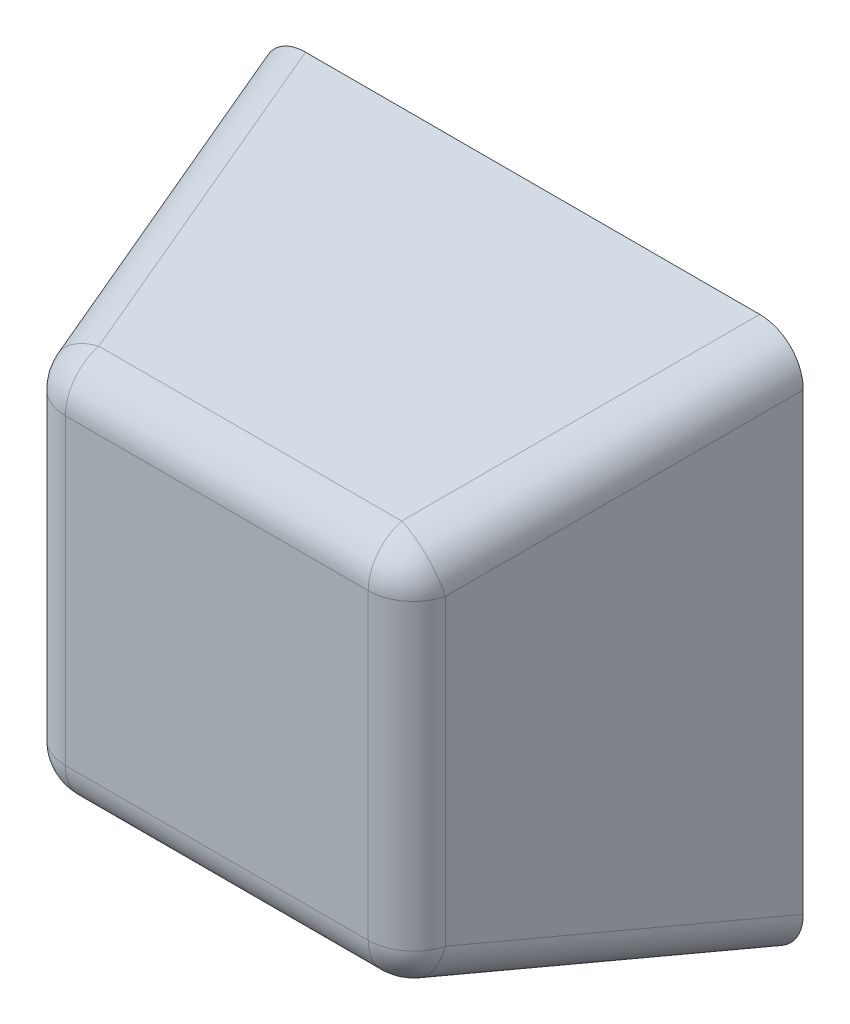
ISO-10303-21;
HEADER;
FILE_DESCRIPTION(('STEP AP214'),'2;1');
FILE_NAME('part.step','',(''),(''),'','','');
FILE_SCHEMA(('AUTOMOTIVE_DESIGN { 1 0 10303 214 1 1 1 1 }'));
ENDSEC;
DATA;
#1=APPLICATION_CONTEXT('core data for automotive mechanical design processes');
#2=APPLICATION_PROTOCOL_DEFINITION('international standard','automotive_design',2000,#1);
#3=PRODUCT_CONTEXT('',#1,'mechanical');
#4=PRODUCT('Part','Part','',(#3));
#5=PRODUCT_RELATED_PRODUCT_CATEGORY('part','',(#4));
#6=PRODUCT_DEFINITION_FORMATION('','',#4);
#7=PRODUCT_DEFINITION_CONTEXT('part definition',#1,'design');
#8=PRODUCT_DEFINITION('design','',#6,#7);
#9=PRODUCT_DEFINITION_SHAPE('','',#8);
#10=(LENGTH_UNIT() NAMED_UNIT(*) SI_UNIT(.MILLI.,.METRE.));
#11=(NAMED_UNIT(*) PLANE_ANGLE_UNIT() SI_UNIT($,.RADIAN.));
#12=(NAMED_UNIT(*) SI_UNIT($,.STERADIAN.) SOLID_ANGLE_UNIT());
#13=UNCERTAINTY_MEASURE_WITH_UNIT(LENGTH_MEASURE(1.E-05),#10,'distance_accuracy_value','');
#14=(GEOMETRIC_REPRESENTATION_CONTEXT(3) GLOBAL_UNCERTAINTY_ASSIGNED_CONTEXT((#13)) GLOBAL_UNIT_ASSIGNED_CONTEXT((#10,
#11,#12)) REPRESENTATION_CONTEXT('',''));
#15=CARTESIAN_POINT('',(0.,0.,0.));
#16=DIRECTION('',(0.,0.,1.));
#17=DIRECTION('',(1.,0.,0.));
#18=AXIS2_PLACEMENT_3D('',#15,#16,#17);
#19=CARTESIAN_POINT('',(0.,0.,0.));
#20=DIRECTION('',(-0.965925826289068,0.,0.258819045102521));
#21=DIRECTION('',(0.258819045102521,0.,0.965925826289068));
#22=AXIS2_PLACEMENT_3D('',#19,#20,#21);
#23=PLANE('',#22);
#24=DIRECTION('',(0.,-1.,0.));
#25=VECTOR('',#24,1.);
#26=CARTESIAN_POINT('',(0.,0.,0.));
#27=LINE('',#26,#25);
#28=CARTESIAN_POINT('',(0.,11.0340741737109,0.));
#29=VERTEX_POINT('',#28);
#30=CARTESIAN_POINT('',(0.,0.965925826289068,0.));
#31=VERTEX_POINT('',#30);
#32=EDGE_CURVE('E197',#29,#31,#27,.T.);
#33=ORIENTED_EDGE('',*,*,#32,.T.);
#34=DIRECTION('',(0.250562807085732,0.250562807085732,0.935113126531029));
#35=VECTOR('',#34,1.);
#36=CARTESIAN_POINT('',(-0.0606424850514894,0.905283341237579,-0.226320835309395));
#37=LINE('',#36,#35);
#38=CARTESIAN_POINT('',(1.67704550870775,2.64297133499682,6.25881904510252));
#39=VERTEX_POINT('',#38);
#40=EDGE_CURVE('E49',#31,#39,#37,.T.);
#41=ORIENTED_EDGE('',*,*,#40,.T.);
#42=DIRECTION('',(0.,-1.,0.));
#43=VECTOR('',#42,1.);
#44=CARTESIAN_POINT('',(1.67704550870775,0.,6.25881904510252));
#45=LINE('',#44,#43);
#46=CARTESIAN_POINT('',(1.67704550870775,9.35702866500318,6.25881904510252));
#47=VERTEX_POINT('',#46);
#48=EDGE_CURVE('E54',#39,#47,#45,.F.);
#49=ORIENTED_EDGE('',*,*,#48,.T.);
#50=DIRECTION('',(0.250562807085732,-0.250562807085732,0.935113126531029));
#51=VECTOR('',#50,1.);
#52=CARTESIAN_POINT('',(0.692738158484689,10.3413360152262,2.58533400380656));
#53=LINE('',#52,#51);
#54=EDGE_CURVE('E166',#47,#29,#53,.F.);
#55=ORIENTED_EDGE('',*,*,#54,.T.);
#56=EDGE_LOOP('',(#33,#41,#49,#55));
#57=FACE_BOUND('',#56,.T.);
#58=ADVANCED_FACE('F32',(#57),#23,.T.);
#59=CARTESIAN_POINT('',(0.,0.,0.));
#60=DIRECTION('',(0.,-0.965925826289068,0.258819045102521));
#61=DIRECTION('',(0.,-0.258819045102521,-0.965925826289068));
#62=AXIS2_PLACEMENT_3D('',#59,#60,#61);
#63=PLANE('',#62);
#64=DIRECTION('',(1.,0.,0.));
#65=VECTOR('',#64,1.);
#66=CARTESIAN_POINT('',(0.,1.67704550870775,6.25881904510252));
#67=LINE('',#66,#65);
#68=CARTESIAN_POINT('',(9.35702866500318,1.67704550870775,6.25881904510252));
#69=VERTEX_POINT('',#68);
#70=CARTESIAN_POINT('',(2.64297133499682,1.67704550870775,6.25881904510252));
#71=VERTEX_POINT('',#70);
#72=EDGE_CURVE('E162',#69,#71,#67,.F.);
#73=ORIENTED_EDGE('',*,*,#72,.T.);
#74=DIRECTION('',(0.250562807085732,0.250562807085732,0.935113126531029));
#75=VECTOR('',#74,1.);
#76=CARTESIAN_POINT('',(0.905283341237579,-0.0606424850514895,-0.226320835309395));
#77=LINE('',#76,#75);
#78=CARTESIAN_POINT('',(0.965925826289069,0.,0.));
#79=VERTEX_POINT('',#78);
#80=EDGE_CURVE('E164',#71,#79,#77,.F.);
#81=ORIENTED_EDGE('',*,*,#80,.T.);
#82=DIRECTION('',(1.,0.,0.));
#83=VECTOR('',#82,1.);
#84=CARTESIAN_POINT('',(0.,0.,0.));
#85=LINE('',#84,#83);
#86=CARTESIAN_POINT('',(11.0340741737109,0.,0.));
#87=VERTEX_POINT('',#86);
#88=EDGE_CURVE('E199',#79,#87,#85,.T.);
#89=ORIENTED_EDGE('',*,*,#88,.T.);
#90=DIRECTION('',(-0.250562807085732,0.250562807085732,0.935113126531029));
#91=VECTOR('',#90,1.);
#92=CARTESIAN_POINT('',(10.3413360152262,0.692738158484689,2.58533400380656));
#93=LINE('',#92,#91);
#94=EDGE_CURVE('E160',#87,#69,#93,.T.);
#95=ORIENTED_EDGE('',*,*,#94,.T.);
#96=EDGE_LOOP('',(#73,#81,#89,#95));
#97=FACE_BOUND('',#96,.T.);
#98=ADVANCED_FACE('F251',(#97),#63,.T.);
#99=CARTESIAN_POINT('',(12.,0.,0.));
#100=DIRECTION('',(0.965925826289068,0.,0.258819045102521));
#101=DIRECTION('',(0.258819045102521,0.,-0.965925826289068));
#102=AXIS2_PLACEMENT_3D('',#99,#100,#101);
#103=PLANE('',#102);
#104=DIRECTION('',(0.,1.,0.));
#105=VECTOR('',#104,1.);
#106=CARTESIAN_POINT('',(12.,0.,0.));
#107=LINE('',#106,#105);
#108=CARTESIAN_POINT('',(12.,0.965925826289069,0.));
#109=VERTEX_POINT('',#108);
#110=CARTESIAN_POINT('',(12.,11.0340741737109,0.));
#111=VERTEX_POINT('',#110);
#112=EDGE_CURVE('E203',#109,#111,#107,.T.);
#113=ORIENTED_EDGE('',*,*,#112,.T.);
#114=DIRECTION('',(-0.250562807085732,-0.250562807085732,0.935113126531029));
#115=VECTOR('',#114,1.);
#116=CARTESIAN_POINT('',(11.3072618415153,10.3413360152262,2.58533400380656));
#117=LINE('',#116,#115);
#118=CARTESIAN_POINT('',(10.3229544912922,9.35702866500318,6.25881904510252));
#119=VERTEX_POINT('',#118);
#120=EDGE_CURVE('E158',#111,#119,#117,.T.);
#121=ORIENTED_EDGE('',*,*,#120,.T.);
#122=DIRECTION('',(0.,1.,0.));
#123=VECTOR('',#122,1.);
#124=CARTESIAN_POINT('',(10.3229544912922,0.,6.25881904510252));
#125=LINE('',#124,#123);
#126=CARTESIAN_POINT('',(10.3229544912922,2.64297133499682,6.25881904510252));
#127=VERTEX_POINT('',#126);
#128=EDGE_CURVE('E156',#119,#127,#125,.F.);
#129=ORIENTED_EDGE('',*,*,#128,.T.);
#130=DIRECTION('',(-0.250562807085732,0.250562807085732,0.935113126531029));
#131=VECTOR('',#130,1.);
#132=CARTESIAN_POINT('',(12.0606424850515,0.905283341237579,-0.226320835309395));
#133=LINE('',#132,#131);
#134=EDGE_CURVE('E154',#127,#109,#133,.F.);
#135=ORIENTED_EDGE('',*,*,#134,.T.);
#136=EDGE_LOOP('',(#113,#121,#129,#135));
#137=FACE_BOUND('',#136,.T.);
#138=ADVANCED_FACE('F256',(#137),#103,.T.);
#139=CARTESIAN_POINT('',(0.,12.,0.));
#140=DIRECTION('',(0.,0.965925826289068,0.258819045102521));
#141=DIRECTION('',(0.,-0.258819045102521,0.965925826289068));
#142=AXIS2_PLACEMENT_3D('',#139,#140,#141);
#143=PLANE('',#142);
#144=DIRECTION('',(-1.,0.,0.));
#145=VECTOR('',#144,1.);
#146=CARTESIAN_POINT('',(0.,12.,0.));
#147=LINE('',#146,#145);
#148=CARTESIAN_POINT('',(11.0340741737109,12.,0.));
#149=VERTEX_POINT('',#148);
#150=CARTESIAN_POINT('',(0.965925826289068,12.,0.));
#151=VERTEX_POINT('',#150);
#152=EDGE_CURVE('E139',#149,#151,#147,.T.);
#153=ORIENTED_EDGE('',*,*,#152,.T.);
#154=DIRECTION('',(0.250562807085732,-0.250562807085732,0.935113126531029));
#155=VECTOR('',#154,1.);
#156=CARTESIAN_POINT('',(0.905283341237578,12.0606424850515,-0.226320835309395));
#157=LINE('',#156,#155);
#158=CARTESIAN_POINT('',(2.64297133499682,10.3229544912922,6.25881904510252));
#159=VERTEX_POINT('',#158);
#160=EDGE_CURVE('E152',#151,#159,#157,.T.);
#161=ORIENTED_EDGE('',*,*,#160,.T.);
#162=DIRECTION('',(-1.,0.,0.));
#163=VECTOR('',#162,1.);
#164=CARTESIAN_POINT('',(0.,10.3229544912922,6.25881904510252));
#165=LINE('',#164,#163);
#166=CARTESIAN_POINT('',(9.35702866500318,10.3229544912922,6.25881904510252));
#167=VERTEX_POINT('',#166);
#168=EDGE_CURVE('E117',#159,#167,#165,.F.);
#169=ORIENTED_EDGE('',*,*,#168,.T.);
#170=DIRECTION('',(-0.250562807085732,-0.250562807085732,0.935113126531029));
#171=VECTOR('',#170,1.);
#172=CARTESIAN_POINT('',(10.3413360152262,11.3072618415153,2.58533400380656));
#173=LINE('',#172,#171);
#174=EDGE_CURVE('E145',#167,#149,#173,.F.);
#175=ORIENTED_EDGE('',*,*,#174,.T.);
#176=EDGE_LOOP('',(#153,#161,#169,#175));
#177=FACE_BOUND('',#176,.T.);
#178=ADVANCED_FACE('F228',(#177),#143,.T.);
#179=CARTESIAN_POINT('',(0.,12.,7.));
#180=DIRECTION('',(0.,0.,-1.));
#181=DIRECTION('',(-1.,0.,0.));
#182=AXIS2_PLACEMENT_3D('',#179,#180,#181);
#183=PLANE('',#182);
#184=DIRECTION('',(0.,-1.,0.));
#185=VECTOR('',#184,1.);
#186=CARTESIAN_POINT('',(9.35702866500318,12.,7.));
#187=LINE('',#186,#185);
#188=CARTESIAN_POINT('',(9.35702866500318,2.64297133499682,7.));
#189=VERTEX_POINT('',#188);
#190=CARTESIAN_POINT('',(9.35702866500318,9.35702866500318,7.));
#191=VERTEX_POINT('',#190);
#192=EDGE_CURVE('E143',#189,#191,#187,.F.);
#193=ORIENTED_EDGE('',*,*,#192,.T.);
#194=DIRECTION('',(1.,0.,0.));
#195=VECTOR('',#194,1.);
#196=CARTESIAN_POINT('',(0.,9.35702866500318,7.));
#197=LINE('',#196,#195);
#198=CARTESIAN_POINT('',(2.64297133499682,9.35702866500318,7.));
#199=VERTEX_POINT('',#198);
#200=EDGE_CURVE('E115',#191,#199,#197,.F.);
#201=ORIENTED_EDGE('',*,*,#200,.T.);
#202=DIRECTION('',(0.,1.,0.));
#203=VECTOR('',#202,1.);
#204=CARTESIAN_POINT('',(2.64297133499682,12.,7.));
#205=LINE('',#204,#203);
#206=CARTESIAN_POINT('',(2.64297133499682,2.64297133499682,7.));
#207=VERTEX_POINT('',#206);
#208=EDGE_CURVE('E132',#199,#207,#205,.F.);
#209=ORIENTED_EDGE('',*,*,#208,.T.);
#210=DIRECTION('',(-1.,0.,0.));
#211=VECTOR('',#210,1.);
#212=CARTESIAN_POINT('',(0.,2.64297133499682,7.));
#213=LINE('',#212,#211);
#214=EDGE_CURVE('E138',#207,#189,#213,.F.);
#215=ORIENTED_EDGE('',*,*,#214,.T.);
#216=EDGE_LOOP('',(#193,#201,#209,#215));
#217=FACE_BOUND('',#216,.T.);
#218=ADVANCED_FACE('F141',(#217),#183,.F.);
#219=CARTESIAN_POINT('',(0.,12.,0.));
#220=DIRECTION('',(0.,0.,-1.));
#221=DIRECTION('',(-1.,0.,0.));
#222=AXIS2_PLACEMENT_3D('',#219,#220,#221);
#223=PLANE('',#222);
#224=ORIENTED_EDGE('',*,*,#88,.F.);
#225=CARTESIAN_POINT('',(1.03527618041008,1.03527618041008,0.));
#226=DIRECTION('',(0.,0.,-1.));
#227=DIRECTION('',(-0.707106781186548,-0.707106781186548,0.));
#228=AXIS2_PLACEMENT_3D('',#225,#226,#227);
#229=ELLIPSE('',#228,1.06938933015482,1.);
#230=EDGE_CURVE('E11',#79,#31,#229,.T.);
#231=ORIENTED_EDGE('',*,*,#230,.T.);
#232=ORIENTED_EDGE('',*,*,#32,.F.);
#233=CARTESIAN_POINT('',(1.03527618041008,10.9647238195899,0.));
#234=DIRECTION('',(0.,0.,-1.));
#235=DIRECTION('',(-0.707106781186548,0.707106781186548,0.));
#236=AXIS2_PLACEMENT_3D('',#233,#234,#235);
#237=ELLIPSE('',#236,1.06938933015482,1.);
#238=EDGE_CURVE('E41',#29,#151,#237,.T.);
#239=ORIENTED_EDGE('',*,*,#238,.T.);
#240=ORIENTED_EDGE('',*,*,#152,.F.);
#241=CARTESIAN_POINT('',(10.9647238195899,10.9647238195899,0.));
#242=DIRECTION('',(0.,0.,-1.));
#243=DIRECTION('',(0.707106781186548,0.707106781186548,0.));
#244=AXIS2_PLACEMENT_3D('',#241,#242,#243);
#245=ELLIPSE('',#244,1.06938933015482,1.);
#246=EDGE_CURVE('E172',#149,#111,#245,.T.);
#247=ORIENTED_EDGE('',*,*,#246,.T.);
#248=ORIENTED_EDGE('',*,*,#112,.F.);
#249=CARTESIAN_POINT('',(10.9647238195899,1.03527618041008,0.));
#250=DIRECTION('',(0.,0.,-1.));
#251=DIRECTION('',(0.707106781186548,-0.707106781186548,0.));
#252=AXIS2_PLACEMENT_3D('',#249,#250,#251);
#253=ELLIPSE('',#252,1.06938933015482,1.);
#254=EDGE_CURVE('E170',#109,#87,#253,.T.);
#255=ORIENTED_EDGE('',*,*,#254,.T.);
#256=EDGE_LOOP('',(#224,#231,#232,#239,#240,#247,#248,#255));
#257=FACE_BOUND('',#256,.T.);
#258=ADVANCED_FACE('F235',(#257),#223,.T.);
#259=CARTESIAN_POINT('',(11.0947166587624,0.905283341237579,-0.485139880411916));
#260=DIRECTION('',(0.250562807085732,-0.250562807085732,-0.935113126531029));
#261=DIRECTION('',(-0.965925826289068,0.,-0.258819045102521));
#262=AXIS2_PLACEMENT_3D('',#259,#260,#261);
#263=CYLINDRICAL_SURFACE('',#262,1.);
#264=ORIENTED_EDGE('',*,*,#254,.F.);
#265=ORIENTED_EDGE('',*,*,#134,.F.);
#266=CARTESIAN_POINT('',(9.35702866500318,2.64297133499682,6.));
#267=DIRECTION('',(-0.250562807085732,0.250562807085732,0.935113126531029));
#268=DIRECTION('',(0.965925826289068,0.,0.258819045102521));
#269=AXIS2_PLACEMENT_3D('',#266,#267,#268);
#270=CIRCLE('',#269,1.);
#271=EDGE_CURVE('E36',#69,#127,#270,.T.);
#272=ORIENTED_EDGE('',*,*,#271,.F.);
#273=ORIENTED_EDGE('',*,*,#94,.F.);
#274=EDGE_LOOP('',(#264,#265,#272,#273));
#275=FACE_BOUND('',#274,.T.);
#276=ADVANCED_FACE('F34',(#275),#263,.T.);
#277=CARTESIAN_POINT('',(0.,2.64297133499682,6.));
#278=DIRECTION('',(-1.,0.,0.));
#279=DIRECTION('',(0.,0.,1.));
#280=AXIS2_PLACEMENT_3D('',#277,#278,#279);
#281=CYLINDRICAL_SURFACE('',#280,1.);
#282=CARTESIAN_POINT('',(2.64297133499682,2.64297133499682,6.));
#283=DIRECTION('',(-1.,0.,0.));
#284=DIRECTION('',(0.,0.,1.));
#285=AXIS2_PLACEMENT_3D('',#282,#283,#284);
#286=CIRCLE('',#285,1.);
#287=EDGE_CURVE('E189',#71,#207,#286,.T.);
#288=ORIENTED_EDGE('',*,*,#287,.F.);
#289=ORIENTED_EDGE('',*,*,#72,.F.);
#290=CARTESIAN_POINT('',(9.35702866500318,2.64297133499682,6.));
#291=DIRECTION('',(1.,0.,0.));
#292=DIRECTION('',(0.,0.,-1.));
#293=AXIS2_PLACEMENT_3D('',#290,#291,#292);
#294=CIRCLE('',#293,1.);
#295=EDGE_CURVE('E191',#189,#69,#294,.T.);
#296=ORIENTED_EDGE('',*,*,#295,.F.);
#297=ORIENTED_EDGE('',*,*,#214,.F.);
#298=EDGE_LOOP('',(#288,#289,#296,#297));
#299=FACE_BOUND('',#298,.T.);
#300=ADVANCED_FACE('F212',(#299),#281,.T.);
#301=CARTESIAN_POINT('',(0.905283341237579,0.905283341237579,-0.485139880411916));
#302=DIRECTION('',(-0.250562807085732,-0.250562807085732,-0.935113126531029));
#303=DIRECTION('',(-0.965925826289068,0.,0.258819045102521));
#304=AXIS2_PLACEMENT_3D('',#301,#302,#303);
#305=CYLINDRICAL_SURFACE('',#304,1.);
#306=ORIENTED_EDGE('',*,*,#230,.F.);
#307=ORIENTED_EDGE('',*,*,#80,.F.);
#308=CARTESIAN_POINT('',(2.64297133499682,2.64297133499682,6.));
#309=DIRECTION('',(0.250562807085732,0.250562807085732,0.935113126531029));
#310=DIRECTION('',(0.965925826289068,0.,-0.258819045102521));
#311=AXIS2_PLACEMENT_3D('',#308,#309,#310);
#312=CIRCLE('',#311,1.);
#313=EDGE_CURVE('E186',#39,#71,#312,.T.);
#314=ORIENTED_EDGE('',*,*,#313,.F.);
#315=ORIENTED_EDGE('',*,*,#40,.F.);
#316=EDGE_LOOP('',(#306,#307,#314,#315));
#317=FACE_BOUND('',#316,.T.);
#318=ADVANCED_FACE('F239',(#317),#305,.T.);
#319=CARTESIAN_POINT('',(9.35702866500318,2.64297133499682,6.));
#320=DIRECTION('',(0.,0.,1.));
#321=DIRECTION('',(1.,0.,0.));
#322=AXIS2_PLACEMENT_3D('',#319,#320,#321);
#323=SPHERICAL_SURFACE('',#322,1.);
#324=ORIENTED_EDGE('',*,*,#295,.T.);
#325=ORIENTED_EDGE('',*,*,#271,.T.);
#326=CARTESIAN_POINT('',(9.35702866500318,2.64297133499682,6.));
#327=DIRECTION('',(0.,-1.,0.));
#328=DIRECTION('',(0.,0.,-1.));
#329=AXIS2_PLACEMENT_3D('',#326,#327,#328);
#330=CIRCLE('',#329,1.);
#331=EDGE_CURVE('E183',#189,#127,#330,.F.);
#332=ORIENTED_EDGE('',*,*,#331,.F.);
#333=EDGE_LOOP('',(#324,#325,#332));
#334=FACE_BOUND('',#333,.T.);
#335=ADVANCED_FACE('F213',(#334),#323,.T.);
#336=CARTESIAN_POINT('',(2.64297133499682,2.64297133499682,6.));
#337=DIRECTION('',(0.,0.,1.));
#338=DIRECTION('',(1.,0.,0.));
#339=AXIS2_PLACEMENT_3D('',#336,#337,#338);
#340=SPHERICAL_SURFACE('',#339,1.);
#341=ORIENTED_EDGE('',*,*,#313,.T.);
#342=ORIENTED_EDGE('',*,*,#287,.T.);
#343=CARTESIAN_POINT('',(2.64297133499682,2.64297133499682,6.));
#344=DIRECTION('',(0.,-1.,0.));
#345=DIRECTION('',(1.,0.,0.));
#346=AXIS2_PLACEMENT_3D('',#343,#344,#345);
#347=CIRCLE('',#346,1.);
#348=EDGE_CURVE('E135',#39,#207,#347,.F.);
#349=ORIENTED_EDGE('',*,*,#348,.F.);
#350=EDGE_LOOP('',(#341,#342,#349));
#351=FACE_BOUND('',#350,.T.);
#352=ADVANCED_FACE('F241',(#351),#340,.T.);
#353=CARTESIAN_POINT('',(10.3413360152262,10.3413360152262,2.32651495870404));
#354=DIRECTION('',(0.250562807085732,0.250562807085732,-0.935113126531029));
#355=DIRECTION('',(-0.965925826289068,0.,-0.258819045102521));
#356=AXIS2_PLACEMENT_3D('',#353,#354,#355);
#357=CYLINDRICAL_SURFACE('',#356,1.);
#358=ORIENTED_EDGE('',*,*,#246,.F.);
#359=ORIENTED_EDGE('',*,*,#174,.F.);
#360=CARTESIAN_POINT('',(9.35702866500318,9.35702866500318,6.));
#361=DIRECTION('',(-0.250562807085732,-0.250562807085732,0.935113126531029));
#362=DIRECTION('',(0.965925826289068,0.,0.258819045102521));
#363=AXIS2_PLACEMENT_3D('',#360,#361,#362);
#364=CIRCLE('',#363,1.);
#365=EDGE_CURVE('E179',#119,#167,#364,.T.);
#366=ORIENTED_EDGE('',*,*,#365,.F.);
#367=ORIENTED_EDGE('',*,*,#120,.F.);
#368=EDGE_LOOP('',(#358,#359,#366,#367));
#369=FACE_BOUND('',#368,.T.);
#370=ADVANCED_FACE('F225',(#369),#357,.T.);
#371=CARTESIAN_POINT('',(9.35702866500318,12.,6.));
#372=DIRECTION('',(0.,-1.,0.));
#373=DIRECTION('',(0.,0.,-1.));
#374=AXIS2_PLACEMENT_3D('',#371,#372,#373);
#375=CYLINDRICAL_SURFACE('',#374,1.);
#376=ORIENTED_EDGE('',*,*,#331,.T.);
#377=ORIENTED_EDGE('',*,*,#128,.F.);
#378=CARTESIAN_POINT('',(9.35702866500318,9.35702866500318,6.));
#379=DIRECTION('',(0.,1.,0.));
#380=DIRECTION('',(0.,0.,1.));
#381=AXIS2_PLACEMENT_3D('',#378,#379,#380);
#382=CIRCLE('',#381,1.);
#383=EDGE_CURVE('E129',#191,#119,#382,.T.);
#384=ORIENTED_EDGE('',*,*,#383,.F.);
#385=ORIENTED_EDGE('',*,*,#192,.F.);
#386=EDGE_LOOP('',(#376,#377,#384,#385));
#387=FACE_BOUND('',#386,.T.);
#388=ADVANCED_FACE('F216',(#387),#375,.T.);
#389=CARTESIAN_POINT('',(2.64297133499682,12.,6.));
#390=DIRECTION('',(0.,1.,0.));
#391=DIRECTION('',(0.,0.,1.));
#392=AXIS2_PLACEMENT_3D('',#389,#390,#391);
#393=CYLINDRICAL_SURFACE('',#392,1.);
#394=ORIENTED_EDGE('',*,*,#348,.T.);
#395=ORIENTED_EDGE('',*,*,#208,.F.);
#396=CARTESIAN_POINT('',(2.64297133499682,9.35702866500318,6.));
#397=DIRECTION('',(0.,1.,0.));
#398=DIRECTION('',(0.,0.,1.));
#399=AXIS2_PLACEMENT_3D('',#396,#397,#398);
#400=CIRCLE('',#399,1.);
#401=EDGE_CURVE('E123',#47,#199,#400,.T.);
#402=ORIENTED_EDGE('',*,*,#401,.F.);
#403=ORIENTED_EDGE('',*,*,#48,.F.);
#404=EDGE_LOOP('',(#394,#395,#402,#403));
#405=FACE_BOUND('',#404,.T.);
#406=ADVANCED_FACE('F133',(#405),#393,.T.);
#407=CARTESIAN_POINT('',(1.65866398477376,10.3413360152262,2.32651495870404));
#408=DIRECTION('',(-0.250562807085732,0.250562807085732,-0.935113126531029));
#409=DIRECTION('',(-0.965925826289068,0.,0.258819045102521));
#410=AXIS2_PLACEMENT_3D('',#407,#408,#409);
#411=CYLINDRICAL_SURFACE('',#410,1.);
#412=ORIENTED_EDGE('',*,*,#238,.F.);
#413=ORIENTED_EDGE('',*,*,#54,.F.);
#414=CARTESIAN_POINT('',(2.64297133499682,9.35702866500318,6.));
#415=DIRECTION('',(0.250562807085732,-0.250562807085732,0.935113126531029));
#416=DIRECTION('',(0.,-0.965925826289068,-0.258819045102521));
#417=AXIS2_PLACEMENT_3D('',#414,#415,#416);
#418=CIRCLE('',#417,1.);
#419=EDGE_CURVE('E127',#159,#47,#418,.T.);
#420=ORIENTED_EDGE('',*,*,#419,.F.);
#421=ORIENTED_EDGE('',*,*,#160,.F.);
#422=EDGE_LOOP('',(#412,#413,#420,#421));
#423=FACE_BOUND('',#422,.T.);
#424=ADVANCED_FACE('F232',(#423),#411,.T.);
#425=CARTESIAN_POINT('',(9.35702866500318,9.35702866500318,6.));
#426=DIRECTION('',(0.,0.,1.));
#427=DIRECTION('',(1.,0.,0.));
#428=AXIS2_PLACEMENT_3D('',#425,#426,#427);
#429=SPHERICAL_SURFACE('',#428,1.);
#430=ORIENTED_EDGE('',*,*,#383,.T.);
#431=ORIENTED_EDGE('',*,*,#365,.T.);
#432=CARTESIAN_POINT('',(9.35702866500318,9.35702866500318,6.));
#433=DIRECTION('',(1.,0.,0.));
#434=DIRECTION('',(0.,0.,-1.));
#435=AXIS2_PLACEMENT_3D('',#432,#433,#434);
#436=CIRCLE('',#435,1.);
#437=EDGE_CURVE('E120',#191,#167,#436,.F.);
#438=ORIENTED_EDGE('',*,*,#437,.F.);
#439=EDGE_LOOP('',(#430,#431,#438));
#440=FACE_BOUND('',#439,.T.);
#441=ADVANCED_FACE('F220',(#440),#429,.T.);
#442=CARTESIAN_POINT('',(2.64297133499682,9.35702866500318,6.));
#443=DIRECTION('',(0.,0.,1.));
#444=DIRECTION('',(1.,0.,0.));
#445=AXIS2_PLACEMENT_3D('',#442,#443,#444);
#446=SPHERICAL_SURFACE('',#445,1.);
#447=ORIENTED_EDGE('',*,*,#419,.T.);
#448=ORIENTED_EDGE('',*,*,#401,.T.);
#449=CARTESIAN_POINT('',(2.64297133499682,9.35702866500318,6.));
#450=DIRECTION('',(-1.,0.,0.));
#451=DIRECTION('',(0.,0.,1.));
#452=AXIS2_PLACEMENT_3D('',#449,#450,#451);
#453=CIRCLE('',#452,1.);
#454=EDGE_CURVE('E111',#159,#199,#453,.F.);
#455=ORIENTED_EDGE('',*,*,#454,.F.);
#456=EDGE_LOOP('',(#447,#448,#455));
#457=FACE_BOUND('',#456,.T.);
#458=ADVANCED_FACE('F125',(#457),#446,.T.);
#459=CARTESIAN_POINT('',(0.,9.35702866500318,6.));
#460=DIRECTION('',(1.,0.,0.));
#461=DIRECTION('',(0.,0.,-1.));
#462=AXIS2_PLACEMENT_3D('',#459,#460,#461);
#463=CYLINDRICAL_SURFACE('',#462,1.);
#464=ORIENTED_EDGE('',*,*,#437,.T.);
#465=ORIENTED_EDGE('',*,*,#168,.F.);
#466=ORIENTED_EDGE('',*,*,#454,.T.);
#467=ORIENTED_EDGE('',*,*,#200,.F.);
#468=EDGE_LOOP('',(#464,#465,#466,#467));
#469=FACE_BOUND('',#468,.T.);
#470=ADVANCED_FACE('F113',(#469),#463,.T.);
#471=CLOSED_SHELL('',(#58,#98,#138,#178,#218,#258,#276,#300,#318,#335,#352,#370,#388,#406,#424,
#441,#458,#470));
#472=MANIFOLD_SOLID_BREP('B2',#471);
#473=ADVANCED_BREP_SHAPE_REPRESENTATION('',(#18,#472),#14);
#474=SHAPE_DEFINITION_REPRESENTATION(#9,#473);
ENDSEC;
END-ISO-10303-21;
